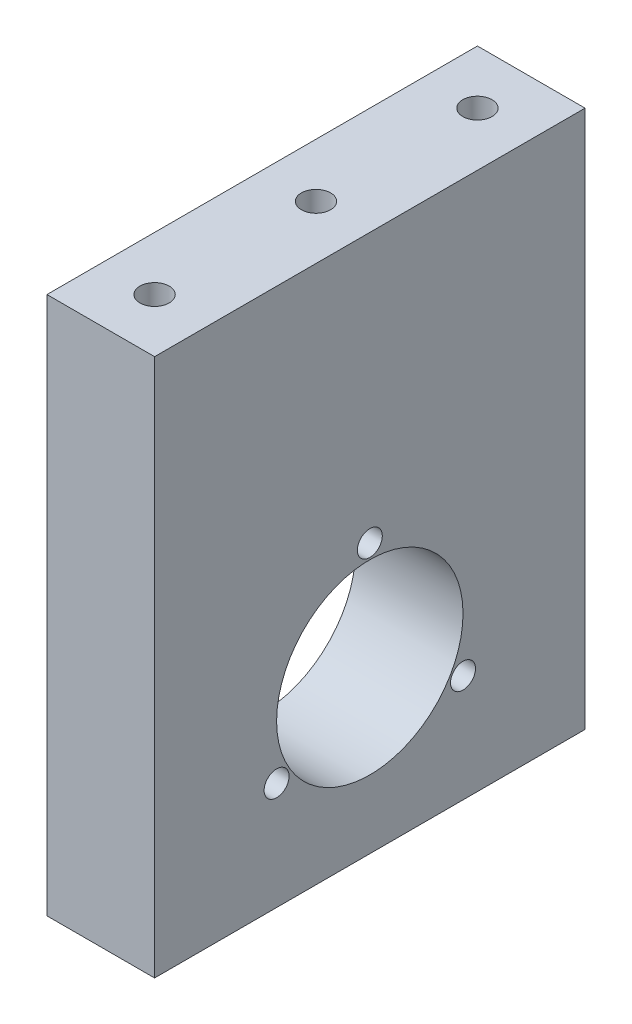
ISO-10303-21;
HEADER;
FILE_DESCRIPTION(('STEP AP214'),'2;1');
FILE_NAME('part.step','',(''),(''),'','','');
FILE_SCHEMA(('AUTOMOTIVE_DESIGN { 1 0 10303 214 1 1 1 1 }'));
ENDSEC;
DATA;
#1=APPLICATION_CONTEXT('core data for automotive mechanical design processes');
#2=APPLICATION_PROTOCOL_DEFINITION('international standard','automotive_design',2000,#1);
#3=PRODUCT_CONTEXT('',#1,'mechanical');
#4=PRODUCT('Part','Part','',(#3));
#5=PRODUCT_RELATED_PRODUCT_CATEGORY('part','',(#4));
#6=PRODUCT_DEFINITION_FORMATION('','',#4);
#7=PRODUCT_DEFINITION_CONTEXT('part definition',#1,'design');
#8=PRODUCT_DEFINITION('design','',#6,#7);
#9=PRODUCT_DEFINITION_SHAPE('','',#8);
#10=(LENGTH_UNIT() NAMED_UNIT(*) SI_UNIT(.MILLI.,.METRE.));
#11=(NAMED_UNIT(*) PLANE_ANGLE_UNIT() SI_UNIT($,.RADIAN.));
#12=(NAMED_UNIT(*) SI_UNIT($,.STERADIAN.) SOLID_ANGLE_UNIT());
#13=UNCERTAINTY_MEASURE_WITH_UNIT(LENGTH_MEASURE(1.E-05),#10,'distance_accuracy_value','');
#14=(GEOMETRIC_REPRESENTATION_CONTEXT(3) GLOBAL_UNCERTAINTY_ASSIGNED_CONTEXT((#13)) GLOBAL_UNIT_ASSIGNED_CONTEXT((#10,
#11,#12)) REPRESENTATION_CONTEXT('',''));
#15=CARTESIAN_POINT('',(0.,0.,0.));
#16=DIRECTION('',(0.,0.,1.));
#17=DIRECTION('',(1.,0.,0.));
#18=AXIS2_PLACEMENT_3D('',#15,#16,#17);
#19=CARTESIAN_POINT('',(12.7,-31.75,-25.4));
#20=DIRECTION('',(0.,0.,1.));
#21=DIRECTION('',(1.,0.,0.));
#22=AXIS2_PLACEMENT_3D('',#19,#20,#21);
#23=PLANE('',#22);
#24=DIRECTION('',(0.,1.,0.));
#25=VECTOR('',#24,1.);
#26=CARTESIAN_POINT('',(0.,-31.75,-25.4));
#27=LINE('',#26,#25);
#28=CARTESIAN_POINT('',(0.,-31.75,-25.4));
#29=VERTEX_POINT('',#28);
#30=CARTESIAN_POINT('',(0.,31.75,-25.4));
#31=VERTEX_POINT('',#30);
#32=EDGE_CURVE('E129',#29,#31,#27,.T.);
#33=ORIENTED_EDGE('',*,*,#32,.T.);
#34=DIRECTION('',(-1.,0.,0.));
#35=VECTOR('',#34,1.);
#36=CARTESIAN_POINT('',(12.7,31.75,-25.4));
#37=LINE('',#36,#35);
#38=CARTESIAN_POINT('',(12.7,31.75,-25.4));
#39=VERTEX_POINT('',#38);
#40=EDGE_CURVE('E11',#39,#31,#37,.T.);
#41=ORIENTED_EDGE('',*,*,#40,.F.);
#42=DIRECTION('',(0.,1.,0.));
#43=VECTOR('',#42,1.);
#44=CARTESIAN_POINT('',(12.7,-31.75,-25.4));
#45=LINE('',#44,#43);
#46=CARTESIAN_POINT('',(12.7,-31.75,-25.4));
#47=VERTEX_POINT('',#46);
#48=EDGE_CURVE('E130',#47,#39,#45,.T.);
#49=ORIENTED_EDGE('',*,*,#48,.F.);
#50=DIRECTION('',(-1.,0.,0.));
#51=VECTOR('',#50,1.);
#52=CARTESIAN_POINT('',(12.7,-31.75,-25.4));
#53=LINE('',#52,#51);
#54=EDGE_CURVE('E136',#47,#29,#53,.T.);
#55=ORIENTED_EDGE('',*,*,#54,.T.);
#56=EDGE_LOOP('',(#33,#41,#49,#55));
#57=FACE_BOUND('',#56,.T.);
#58=ADVANCED_FACE('F37',(#57),#23,.F.);
#59=CARTESIAN_POINT('',(12.7,31.75,25.4));
#60=DIRECTION('',(0.,-1.,0.));
#61=DIRECTION('',(0.,0.,-1.));
#62=AXIS2_PLACEMENT_3D('',#59,#60,#61);
#63=PLANE('',#62);
#64=CARTESIAN_POINT('',(6.35,31.75,-19.05));
#65=DIRECTION('',(0.,1.,0.));
#66=DIRECTION('',(0.,0.,1.));
#67=AXIS2_PLACEMENT_3D('',#64,#65,#66);
#68=CIRCLE('',#67,1.7272);
#69=CARTESIAN_POINT('',(6.35,31.75,-17.3228));
#70=VERTEX_POINT('',#69);
#71=EDGE_CURVE('E105',#70,#70,#68,.T.);
#72=ORIENTED_EDGE('',*,*,#71,.F.);
#73=EDGE_LOOP('',(#72));
#74=FACE_BOUND('',#73,.T.);
#75=CARTESIAN_POINT('',(6.35,31.75,19.05));
#76=DIRECTION('',(0.,1.,0.));
#77=DIRECTION('',(0.,0.,1.));
#78=AXIS2_PLACEMENT_3D('',#75,#76,#77);
#79=CIRCLE('',#78,1.7272);
#80=CARTESIAN_POINT('',(6.35,31.75,20.7772));
#81=VERTEX_POINT('',#80);
#82=EDGE_CURVE('E104',#81,#81,#79,.T.);
#83=ORIENTED_EDGE('',*,*,#82,.F.);
#84=EDGE_LOOP('',(#83));
#85=FACE_BOUND('',#84,.T.);
#86=CARTESIAN_POINT('',(6.35,31.75,0.));
#87=DIRECTION('',(0.,1.,0.));
#88=DIRECTION('',(0.,0.,1.));
#89=AXIS2_PLACEMENT_3D('',#86,#87,#88);
#90=CIRCLE('',#89,1.7272);
#91=CARTESIAN_POINT('',(6.35,31.75,1.7272));
#92=VERTEX_POINT('',#91);
#93=EDGE_CURVE('E117',#92,#92,#90,.T.);
#94=ORIENTED_EDGE('',*,*,#93,.F.);
#95=EDGE_LOOP('',(#94));
#96=FACE_BOUND('',#95,.T.);
#97=DIRECTION('',(0.,0.,1.));
#98=VECTOR('',#97,1.);
#99=CARTESIAN_POINT('',(0.,31.75,25.4));
#100=LINE('',#99,#98);
#101=CARTESIAN_POINT('',(0.,31.75,25.4));
#102=VERTEX_POINT('',#101);
#103=EDGE_CURVE('E139',#31,#102,#100,.T.);
#104=ORIENTED_EDGE('',*,*,#103,.T.);
#105=DIRECTION('',(-1.,0.,0.));
#106=VECTOR('',#105,1.);
#107=CARTESIAN_POINT('',(12.7,31.75,25.4));
#108=LINE('',#107,#106);
#109=CARTESIAN_POINT('',(12.7,31.75,25.4));
#110=VERTEX_POINT('',#109);
#111=EDGE_CURVE('E45',#110,#102,#108,.T.);
#112=ORIENTED_EDGE('',*,*,#111,.F.);
#113=DIRECTION('',(0.,0.,1.));
#114=VECTOR('',#113,1.);
#115=CARTESIAN_POINT('',(12.7,31.75,25.4));
#116=LINE('',#115,#114);
#117=EDGE_CURVE('E84',#39,#110,#116,.T.);
#118=ORIENTED_EDGE('',*,*,#117,.F.);
#119=ORIENTED_EDGE('',*,*,#40,.T.);
#120=EDGE_LOOP('',(#104,#112,#118,#119));
#121=FACE_BOUND('',#120,.T.);
#122=ADVANCED_FACE('F163',(#74,#85,#96,#121),#63,.F.);
#123=CARTESIAN_POINT('',(12.7,-31.75,25.4));
#124=DIRECTION('',(0.,0.,-1.));
#125=DIRECTION('',(-1.,0.,0.));
#126=AXIS2_PLACEMENT_3D('',#123,#124,#125);
#127=PLANE('',#126);
#128=DIRECTION('',(0.,-1.,0.));
#129=VECTOR('',#128,1.);
#130=CARTESIAN_POINT('',(0.,-31.75,25.4));
#131=LINE('',#130,#129);
#132=CARTESIAN_POINT('',(0.,-31.75,25.4));
#133=VERTEX_POINT('',#132);
#134=EDGE_CURVE('E71',#102,#133,#131,.T.);
#135=ORIENTED_EDGE('',*,*,#134,.T.);
#136=DIRECTION('',(-1.,0.,0.));
#137=VECTOR('',#136,1.);
#138=CARTESIAN_POINT('',(12.7,-31.75,25.4));
#139=LINE('',#138,#137);
#140=CARTESIAN_POINT('',(12.7,-31.75,25.4));
#141=VERTEX_POINT('',#140);
#142=EDGE_CURVE('E144',#141,#133,#139,.T.);
#143=ORIENTED_EDGE('',*,*,#142,.F.);
#144=DIRECTION('',(0.,-1.,0.));
#145=VECTOR('',#144,1.);
#146=CARTESIAN_POINT('',(12.7,-31.75,25.4));
#147=LINE('',#146,#145);
#148=EDGE_CURVE('E133',#110,#141,#147,.T.);
#149=ORIENTED_EDGE('',*,*,#148,.F.);
#150=ORIENTED_EDGE('',*,*,#111,.T.);
#151=EDGE_LOOP('',(#135,#143,#149,#150));
#152=FACE_BOUND('',#151,.T.);
#153=ADVANCED_FACE('F146',(#152),#127,.F.);
#154=CARTESIAN_POINT('',(12.7,-31.75,25.4));
#155=DIRECTION('',(0.,1.,0.));
#156=DIRECTION('',(0.,0.,1.));
#157=AXIS2_PLACEMENT_3D('',#154,#155,#156);
#158=PLANE('',#157);
#159=DIRECTION('',(0.,0.,-1.));
#160=VECTOR('',#159,1.);
#161=CARTESIAN_POINT('',(0.,-31.75,25.4));
#162=LINE('',#161,#160);
#163=EDGE_CURVE('E77',#133,#29,#162,.T.);
#164=ORIENTED_EDGE('',*,*,#163,.T.);
#165=ORIENTED_EDGE('',*,*,#54,.F.);
#166=DIRECTION('',(0.,0.,-1.));
#167=VECTOR('',#166,1.);
#168=CARTESIAN_POINT('',(12.7,-31.75,25.4));
#169=LINE('',#168,#167);
#170=EDGE_CURVE('E53',#141,#47,#169,.T.);
#171=ORIENTED_EDGE('',*,*,#170,.F.);
#172=ORIENTED_EDGE('',*,*,#142,.T.);
#173=EDGE_LOOP('',(#164,#165,#171,#172));
#174=FACE_BOUND('',#173,.T.);
#175=ADVANCED_FACE('F153',(#174),#158,.F.);
#176=CARTESIAN_POINT('',(12.7,0.,0.));
#177=DIRECTION('',(-1.,0.,0.));
#178=DIRECTION('',(0.,0.,1.));
#179=AXIS2_PLACEMENT_3D('',#176,#177,#178);
#180=PLANE('',#179);
#181=CARTESIAN_POINT('',(12.7,-19.0499999999999,-10.9985226280624));
#182=DIRECTION('',(-1.,0.,0.));
#183=DIRECTION('',(0.,0.,1.));
#184=AXIS2_PLACEMENT_3D('',#181,#182,#183);
#185=CIRCLE('',#184,1.4732);
#186=CARTESIAN_POINT('',(12.7,-19.0499999999999,-9.52532262806243));
#187=VERTEX_POINT('',#186);
#188=EDGE_CURVE('E227',#187,#187,#185,.T.);
#189=ORIENTED_EDGE('',*,*,#188,.T.);
#190=EDGE_LOOP('',(#189));
#191=FACE_BOUND('',#190,.T.);
#192=CARTESIAN_POINT('',(12.7,-19.0500000000001,10.9985226280623));
#193=DIRECTION('',(-1.,0.,0.));
#194=DIRECTION('',(0.,0.,1.));
#195=AXIS2_PLACEMENT_3D('',#192,#193,#194);
#196=CIRCLE('',#195,1.4732);
#197=CARTESIAN_POINT('',(12.7,-19.0500000000001,12.4717226280623));
#198=VERTEX_POINT('',#197);
#199=EDGE_CURVE('E220',#198,#198,#196,.T.);
#200=ORIENTED_EDGE('',*,*,#199,.T.);
#201=EDGE_LOOP('',(#200));
#202=FACE_BOUND('',#201,.T.);
#203=CARTESIAN_POINT('',(12.7,0.,0.));
#204=DIRECTION('',(-1.,0.,0.));
#205=DIRECTION('',(0.,0.,1.));
#206=AXIS2_PLACEMENT_3D('',#203,#204,#205);
#207=CIRCLE('',#206,1.47320000000001);
#208=CARTESIAN_POINT('',(12.7,0.,1.47320000000001));
#209=VERTEX_POINT('',#208);
#210=EDGE_CURVE('E111',#209,#209,#207,.T.);
#211=ORIENTED_EDGE('',*,*,#210,.T.);
#212=EDGE_LOOP('',(#211));
#213=FACE_BOUND('',#212,.T.);
#214=CARTESIAN_POINT('',(12.7,-12.7,0.));
#215=DIRECTION('',(1.,0.,0.));
#216=DIRECTION('',(0.,0.,-1.));
#217=AXIS2_PLACEMENT_3D('',#214,#215,#216);
#218=CIRCLE('',#217,11.);
#219=CARTESIAN_POINT('',(12.7,-12.7,-11.));
#220=VERTEX_POINT('',#219);
#221=EDGE_CURVE('E123',#220,#220,#218,.T.);
#222=ORIENTED_EDGE('',*,*,#221,.F.);
#223=EDGE_LOOP('',(#222));
#224=FACE_BOUND('',#223,.T.);
#225=ORIENTED_EDGE('',*,*,#48,.T.);
#226=ORIENTED_EDGE('',*,*,#117,.T.);
#227=ORIENTED_EDGE('',*,*,#148,.T.);
#228=ORIENTED_EDGE('',*,*,#170,.T.);
#229=EDGE_LOOP('',(#225,#226,#227,#228));
#230=FACE_BOUND('',#229,.T.);
#231=ADVANCED_FACE('F155',(#191,#202,#213,#224,#230),#180,.F.);
#232=CARTESIAN_POINT('',(0.,0.,0.));
#233=DIRECTION('',(-1.,0.,0.));
#234=DIRECTION('',(0.,0.,1.));
#235=AXIS2_PLACEMENT_3D('',#232,#233,#234);
#236=PLANE('',#235);
#237=CARTESIAN_POINT('',(0.,-19.0499999999999,-10.9985226280624));
#238=DIRECTION('',(-1.,0.,0.));
#239=DIRECTION('',(0.,0.,1.));
#240=AXIS2_PLACEMENT_3D('',#237,#238,#239);
#241=CIRCLE('',#240,1.47319999999999);
#242=CARTESIAN_POINT('',(0.,-19.0499999999999,-9.52532262806244));
#243=VERTEX_POINT('',#242);
#244=EDGE_CURVE('E206',#243,#243,#241,.T.);
#245=ORIENTED_EDGE('',*,*,#244,.F.);
#246=EDGE_LOOP('',(#245));
#247=FACE_BOUND('',#246,.T.);
#248=CARTESIAN_POINT('',(0.,-19.0500000000001,10.9985226280623));
#249=DIRECTION('',(-1.,0.,0.));
#250=DIRECTION('',(0.,0.,1.));
#251=AXIS2_PLACEMENT_3D('',#248,#249,#250);
#252=CIRCLE('',#251,1.47319999999999);
#253=CARTESIAN_POINT('',(0.,-19.0500000000001,12.4717226280623));
#254=VERTEX_POINT('',#253);
#255=EDGE_CURVE('E210',#254,#254,#252,.T.);
#256=ORIENTED_EDGE('',*,*,#255,.F.);
#257=EDGE_LOOP('',(#256));
#258=FACE_BOUND('',#257,.T.);
#259=CARTESIAN_POINT('',(0.,0.,0.));
#260=DIRECTION('',(-1.,0.,0.));
#261=DIRECTION('',(0.,0.,1.));
#262=AXIS2_PLACEMENT_3D('',#259,#260,#261);
#263=CIRCLE('',#262,1.4732);
#264=CARTESIAN_POINT('',(0.,0.,1.4732));
#265=VERTEX_POINT('',#264);
#266=EDGE_CURVE('E214',#265,#265,#263,.T.);
#267=ORIENTED_EDGE('',*,*,#266,.F.);
#268=EDGE_LOOP('',(#267));
#269=FACE_BOUND('',#268,.T.);
#270=CARTESIAN_POINT('',(0.,-12.7,0.));
#271=DIRECTION('',(1.,0.,0.));
#272=DIRECTION('',(0.,0.,-1.));
#273=AXIS2_PLACEMENT_3D('',#270,#271,#272);
#274=CIRCLE('',#273,11.);
#275=CARTESIAN_POINT('',(0.,-12.7,-11.));
#276=VERTEX_POINT('',#275);
#277=EDGE_CURVE('E126',#276,#276,#274,.T.);
#278=ORIENTED_EDGE('',*,*,#277,.T.);
#279=EDGE_LOOP('',(#278));
#280=FACE_BOUND('',#279,.T.);
#281=ORIENTED_EDGE('',*,*,#32,.F.);
#282=ORIENTED_EDGE('',*,*,#163,.F.);
#283=ORIENTED_EDGE('',*,*,#134,.F.);
#284=ORIENTED_EDGE('',*,*,#103,.F.);
#285=EDGE_LOOP('',(#281,#282,#283,#284));
#286=FACE_BOUND('',#285,.T.);
#287=ADVANCED_FACE('F149',(#247,#258,#269,#280,#286),#236,.T.);
#288=CARTESIAN_POINT('',(12.7,-12.7,0.));
#289=DIRECTION('',(1.,0.,0.));
#290=DIRECTION('',(0.,0.,-1.));
#291=AXIS2_PLACEMENT_3D('',#288,#289,#290);
#292=CYLINDRICAL_SURFACE('',#291,11.);
#293=ORIENTED_EDGE('',*,*,#277,.F.);
#294=EDGE_LOOP('',(#293));
#295=FACE_BOUND('',#294,.T.);
#296=ORIENTED_EDGE('',*,*,#221,.T.);
#297=EDGE_LOOP('',(#296));
#298=FACE_BOUND('',#297,.T.);
#299=ADVANCED_FACE('F191',(#295,#298),#292,.F.);
#300=CARTESIAN_POINT('',(6.35,21.082,0.));
#301=DIRECTION('',(0.,1.,0.));
#302=DIRECTION('',(0.,0.,1.));
#303=AXIS2_PLACEMENT_3D('',#300,#301,#302);
#304=CONICAL_SURFACE('',#303,1.7272,1.02974425867665);
#305=CARTESIAN_POINT('',(6.35,20.0441935388156,0.));
#306=VERTEX_POINT('',#305);
#307=VERTEX_LOOP('',#306);
#308=FACE_BOUND('',#307,.T.);
#309=CARTESIAN_POINT('',(6.35,21.082,0.));
#310=DIRECTION('',(0.,1.,0.));
#311=DIRECTION('',(0.,0.,1.));
#312=AXIS2_PLACEMENT_3D('',#309,#310,#311);
#313=CIRCLE('',#312,1.7272);
#314=CARTESIAN_POINT('',(6.35,21.082,1.7272));
#315=VERTEX_POINT('',#314);
#316=EDGE_CURVE('E120',#315,#315,#313,.T.);
#317=ORIENTED_EDGE('',*,*,#316,.T.);
#318=EDGE_LOOP('',(#317));
#319=FACE_BOUND('',#318,.T.);
#320=ADVANCED_FACE('F182',(#308,#319),#304,.F.);
#321=CARTESIAN_POINT('',(6.35,31.75,0.));
#322=DIRECTION('',(0.,1.,0.));
#323=DIRECTION('',(0.,0.,1.));
#324=AXIS2_PLACEMENT_3D('',#321,#322,#323);
#325=CYLINDRICAL_SURFACE('',#324,1.7272);
#326=ORIENTED_EDGE('',*,*,#316,.F.);
#327=EDGE_LOOP('',(#326));
#328=FACE_BOUND('',#327,.T.);
#329=ORIENTED_EDGE('',*,*,#93,.T.);
#330=EDGE_LOOP('',(#329));
#331=FACE_BOUND('',#330,.T.);
#332=ADVANCED_FACE('F179',(#328,#331),#325,.F.);
#333=CARTESIAN_POINT('',(6.35,21.082,19.05));
#334=DIRECTION('',(0.,1.,0.));
#335=DIRECTION('',(0.,0.,1.));
#336=AXIS2_PLACEMENT_3D('',#333,#334,#335);
#337=CONICAL_SURFACE('',#336,1.7272,1.02974425867665);
#338=CARTESIAN_POINT('',(6.35,20.0441935388156,19.05));
#339=VERTEX_POINT('',#338);
#340=VERTEX_LOOP('',#339);
#341=FACE_BOUND('',#340,.T.);
#342=CARTESIAN_POINT('',(6.35,21.082,19.05));
#343=DIRECTION('',(0.,1.,0.));
#344=DIRECTION('',(0.,0.,1.));
#345=AXIS2_PLACEMENT_3D('',#342,#343,#344);
#346=CIRCLE('',#345,1.7272);
#347=CARTESIAN_POINT('',(6.35,21.082,20.7772));
#348=VERTEX_POINT('',#347);
#349=EDGE_CURVE('E108',#348,#348,#346,.T.);
#350=ORIENTED_EDGE('',*,*,#349,.T.);
#351=EDGE_LOOP('',(#350));
#352=FACE_BOUND('',#351,.T.);
#353=ADVANCED_FACE('F181',(#341,#352),#337,.F.);
#354=CARTESIAN_POINT('',(6.35,31.75,19.05));
#355=DIRECTION('',(0.,1.,0.));
#356=DIRECTION('',(0.,0.,1.));
#357=AXIS2_PLACEMENT_3D('',#354,#355,#356);
#358=CYLINDRICAL_SURFACE('',#357,1.7272);
#359=ORIENTED_EDGE('',*,*,#349,.F.);
#360=EDGE_LOOP('',(#359));
#361=FACE_BOUND('',#360,.T.);
#362=ORIENTED_EDGE('',*,*,#82,.T.);
#363=EDGE_LOOP('',(#362));
#364=FACE_BOUND('',#363,.T.);
#365=ADVANCED_FACE('F98',(#361,#364),#358,.F.);
#366=CARTESIAN_POINT('',(6.35,21.082,-19.05));
#367=DIRECTION('',(0.,1.,0.));
#368=DIRECTION('',(0.,0.,1.));
#369=AXIS2_PLACEMENT_3D('',#366,#367,#368);
#370=CONICAL_SURFACE('',#369,1.7272,1.02974425867665);
#371=CARTESIAN_POINT('',(6.35,20.0441935388156,-19.05));
#372=VERTEX_POINT('',#371);
#373=VERTEX_LOOP('',#372);
#374=FACE_BOUND('',#373,.T.);
#375=CARTESIAN_POINT('',(6.35,21.082,-19.05));
#376=DIRECTION('',(0.,1.,0.));
#377=DIRECTION('',(0.,0.,1.));
#378=AXIS2_PLACEMENT_3D('',#375,#376,#377);
#379=CIRCLE('',#378,1.7272);
#380=CARTESIAN_POINT('',(6.35,21.082,-17.3228));
#381=VERTEX_POINT('',#380);
#382=EDGE_CURVE('E102',#381,#381,#379,.T.);
#383=ORIENTED_EDGE('',*,*,#382,.T.);
#384=EDGE_LOOP('',(#383));
#385=FACE_BOUND('',#384,.T.);
#386=ADVANCED_FACE('F94',(#374,#385),#370,.F.);
#387=CARTESIAN_POINT('',(6.35,31.75,-19.05));
#388=DIRECTION('',(0.,1.,0.));
#389=DIRECTION('',(0.,0.,1.));
#390=AXIS2_PLACEMENT_3D('',#387,#388,#389);
#391=CYLINDRICAL_SURFACE('',#390,1.7272);
#392=ORIENTED_EDGE('',*,*,#382,.F.);
#393=EDGE_LOOP('',(#392));
#394=FACE_BOUND('',#393,.T.);
#395=ORIENTED_EDGE('',*,*,#71,.T.);
#396=EDGE_LOOP('',(#395));
#397=FACE_BOUND('',#396,.T.);
#398=ADVANCED_FACE('F97',(#394,#397),#391,.F.);
#399=CARTESIAN_POINT('',(0.,0.,0.));
#400=DIRECTION('',(-1.,0.,0.));
#401=DIRECTION('',(0.,0.,1.));
#402=AXIS2_PLACEMENT_3D('',#399,#400,#401);
#403=CYLINDRICAL_SURFACE('',#402,1.4732);
#404=ORIENTED_EDGE('',*,*,#210,.F.);
#405=EDGE_LOOP('',(#404));
#406=FACE_BOUND('',#405,.T.);
#407=ORIENTED_EDGE('',*,*,#266,.T.);
#408=EDGE_LOOP('',(#407));
#409=FACE_BOUND('',#408,.T.);
#410=ADVANCED_FACE('F239',(#406,#409),#403,.F.);
#411=CARTESIAN_POINT('',(0.,-19.0500000000001,10.9985226280623));
#412=DIRECTION('',(-1.,0.,0.));
#413=DIRECTION('',(0.,0.,1.));
#414=AXIS2_PLACEMENT_3D('',#411,#412,#413);
#415=CYLINDRICAL_SURFACE('',#414,1.47319999999999);
#416=ORIENTED_EDGE('',*,*,#199,.F.);
#417=EDGE_LOOP('',(#416));
#418=FACE_BOUND('',#417,.T.);
#419=ORIENTED_EDGE('',*,*,#255,.T.);
#420=EDGE_LOOP('',(#419));
#421=FACE_BOUND('',#420,.T.);
#422=ADVANCED_FACE('F233',(#418,#421),#415,.F.);
#423=CARTESIAN_POINT('',(0.,-19.0499999999999,-10.9985226280624));
#424=DIRECTION('',(-1.,0.,0.));
#425=DIRECTION('',(0.,0.,1.));
#426=AXIS2_PLACEMENT_3D('',#423,#424,#425);
#427=CYLINDRICAL_SURFACE('',#426,1.47319999999999);
#428=ORIENTED_EDGE('',*,*,#188,.F.);
#429=EDGE_LOOP('',(#428));
#430=FACE_BOUND('',#429,.T.);
#431=ORIENTED_EDGE('',*,*,#244,.T.);
#432=EDGE_LOOP('',(#431));
#433=FACE_BOUND('',#432,.T.);
#434=ADVANCED_FACE('F231',(#430,#433),#427,.F.);
#435=CLOSED_SHELL('',(#58,#122,#153,#175,#231,#287,#299,#320,#332,#353,#365,#386,#398,#410,#422,#434));
#436=MANIFOLD_SOLID_BREP('B2',#435);
#437=ADVANCED_BREP_SHAPE_REPRESENTATION('',(#18,#436),#14);
#438=SHAPE_DEFINITION_REPRESENTATION(#9,#437);
ENDSEC;
END-ISO-10303-21;
